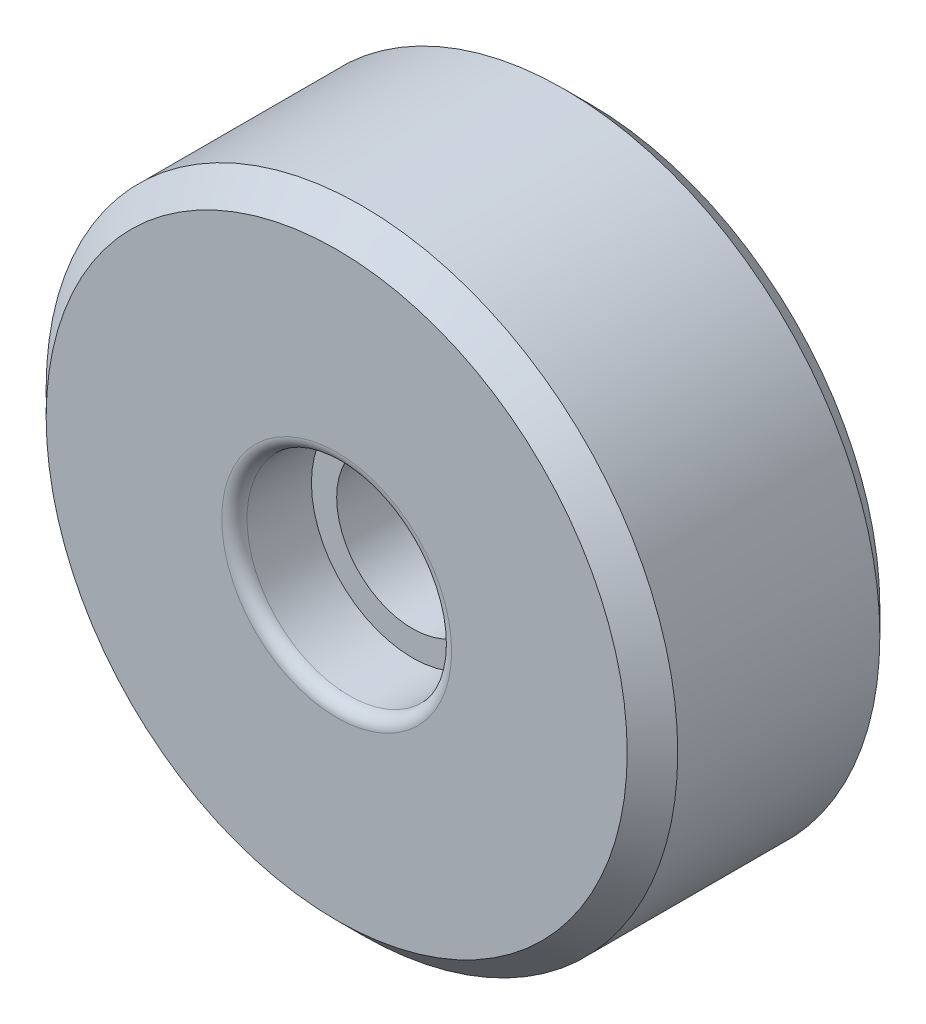
ISO-10303-21;
HEADER;
FILE_DESCRIPTION(('STEP AP214'),'2;1');
FILE_NAME('part.step','',(''),(''),'','','');
FILE_SCHEMA(('AUTOMOTIVE_DESIGN { 1 0 10303 214 1 1 1 1 }'));
ENDSEC;
DATA;
#1=APPLICATION_CONTEXT('core data for automotive mechanical design processes');
#2=APPLICATION_PROTOCOL_DEFINITION('international standard','automotive_design',2000,#1);
#3=PRODUCT_CONTEXT('',#1,'mechanical');
#4=PRODUCT('Part','Part','',(#3));
#5=PRODUCT_RELATED_PRODUCT_CATEGORY('part','',(#4));
#6=PRODUCT_DEFINITION_FORMATION('','',#4);
#7=PRODUCT_DEFINITION_CONTEXT('part definition',#1,'design');
#8=PRODUCT_DEFINITION('design','',#6,#7);
#9=PRODUCT_DEFINITION_SHAPE('','',#8);
#10=(LENGTH_UNIT() NAMED_UNIT(*) SI_UNIT(.MILLI.,.METRE.));
#11=(NAMED_UNIT(*) PLANE_ANGLE_UNIT() SI_UNIT($,.RADIAN.));
#12=(NAMED_UNIT(*) SI_UNIT($,.STERADIAN.) SOLID_ANGLE_UNIT());
#13=UNCERTAINTY_MEASURE_WITH_UNIT(LENGTH_MEASURE(1.E-05),#10,'distance_accuracy_value','');
#14=(GEOMETRIC_REPRESENTATION_CONTEXT(3) GLOBAL_UNCERTAINTY_ASSIGNED_CONTEXT((#13)) GLOBAL_UNIT_ASSIGNED_CONTEXT((#10,
#11,#12)) REPRESENTATION_CONTEXT('',''));
#15=CARTESIAN_POINT('',(0.,0.,0.));
#16=DIRECTION('',(0.,0.,1.));
#17=DIRECTION('',(1.,0.,0.));
#18=AXIS2_PLACEMENT_3D('',#15,#16,#17);
#19=CARTESIAN_POINT('',(0.,0.,7.));
#20=DIRECTION('',(0.,0.,-1.));
#21=DIRECTION('',(-1.,0.,0.));
#22=AXIS2_PLACEMENT_3D('',#19,#20,#21);
#23=CYLINDRICAL_SURFACE('',#22,4.);
#24=CARTESIAN_POINT('',(0.,0.,7.));
#25=DIRECTION('',(0.,0.,-1.));
#26=DIRECTION('',(-1.,0.,0.));
#27=AXIS2_PLACEMENT_3D('',#24,#25,#26);
#28=CIRCLE('',#27,4.);
#29=CARTESIAN_POINT('',(-4.,0.,7.));
#30=VERTEX_POINT('',#29);
#31=EDGE_CURVE('E11',#30,#30,#28,.T.);
#32=ORIENTED_EDGE('',*,*,#31,.T.);
#33=EDGE_LOOP('',(#32));
#34=FACE_BOUND('',#33,.T.);
#35=CARTESIAN_POINT('',(0.,0.,0.));
#36=DIRECTION('',(0.,0.,-1.));
#37=DIRECTION('',(-1.,0.,0.));
#38=AXIS2_PLACEMENT_3D('',#35,#36,#37);
#39=CIRCLE('',#38,4.);
#40=CARTESIAN_POINT('',(-4.,0.,0.));
#41=VERTEX_POINT('',#40);
#42=EDGE_CURVE('E46',#41,#41,#39,.T.);
#43=ORIENTED_EDGE('',*,*,#42,.F.);
#44=EDGE_LOOP('',(#43));
#45=FACE_BOUND('',#44,.T.);
#46=ADVANCED_FACE('F43',(#34,#45),#23,.T.);
#47=CARTESIAN_POINT('',(0.,0.,7.));
#48=DIRECTION('',(0.,0.,-1.));
#49=DIRECTION('',(-1.,0.,0.));
#50=AXIS2_PLACEMENT_3D('',#47,#48,#49);
#51=PLANE('',#50);
#52=CARTESIAN_POINT('',(0.,0.,7.));
#53=DIRECTION('',(0.,0.,-1.));
#54=DIRECTION('',(-1.,0.,0.));
#55=AXIS2_PLACEMENT_3D('',#52,#53,#54);
#56=CIRCLE('',#55,3.);
#57=CARTESIAN_POINT('',(-3.,0.,7.));
#58=VERTEX_POINT('',#57);
#59=EDGE_CURVE('E53',#58,#58,#56,.T.);
#60=ORIENTED_EDGE('',*,*,#59,.T.);
#61=EDGE_LOOP('',(#60));
#62=FACE_BOUND('',#61,.T.);
#63=ORIENTED_EDGE('',*,*,#31,.F.);
#64=EDGE_LOOP('',(#63));
#65=FACE_BOUND('',#64,.T.);
#66=ADVANCED_FACE('F61',(#62,#65),#51,.F.);
#67=CARTESIAN_POINT('',(0.,0.,0.));
#68=DIRECTION('',(0.,0.,-1.));
#69=DIRECTION('',(-1.,0.,0.));
#70=AXIS2_PLACEMENT_3D('',#67,#68,#69);
#71=PLANE('',#70);
#72=CARTESIAN_POINT('',(0.,0.,0.));
#73=DIRECTION('',(0.,0.,-1.));
#74=DIRECTION('',(-1.,0.,0.));
#75=AXIS2_PLACEMENT_3D('',#72,#73,#74);
#76=CIRCLE('',#75,3.);
#77=CARTESIAN_POINT('',(-3.,0.,0.));
#78=VERTEX_POINT('',#77);
#79=EDGE_CURVE('E55',#78,#78,#76,.T.);
#80=ORIENTED_EDGE('',*,*,#79,.F.);
#81=EDGE_LOOP('',(#80));
#82=FACE_BOUND('',#81,.T.);
#83=ORIENTED_EDGE('',*,*,#42,.T.);
#84=EDGE_LOOP('',(#83));
#85=FACE_BOUND('',#84,.T.);
#86=ADVANCED_FACE('F67',(#82,#85),#71,.T.);
#87=CARTESIAN_POINT('',(0.,0.,7.));
#88=DIRECTION('',(0.,0.,-1.));
#89=DIRECTION('',(-1.,0.,0.));
#90=AXIS2_PLACEMENT_3D('',#87,#88,#89);
#91=CYLINDRICAL_SURFACE('',#90,3.);
#92=ORIENTED_EDGE('',*,*,#59,.F.);
#93=EDGE_LOOP('',(#92));
#94=FACE_BOUND('',#93,.T.);
#95=ORIENTED_EDGE('',*,*,#79,.T.);
#96=EDGE_LOOP('',(#95));
#97=FACE_BOUND('',#96,.T.);
#98=ADVANCED_FACE('F64',(#94,#97),#91,.F.);
#99=CLOSED_SHELL('',(#46,#66,#86,#98));
#100=MANIFOLD_SOLID_BREP('B2',#99);
#101=CARTESIAN_POINT('',(0.,0.,10.));
#102=DIRECTION('',(0.,0.,1.));
#103=DIRECTION('',(1.,0.,0.));
#104=AXIS2_PLACEMENT_3D('',#101,#102,#103);
#105=PLANE('',#104);
#106=CARTESIAN_POINT('',(0.,0.,10.));
#107=DIRECTION('',(0.,0.,1.));
#108=DIRECTION('',(1.,0.,0.));
#109=AXIS2_PLACEMENT_3D('',#106,#107,#108);
#110=CIRCLE('',#109,4.55);
#111=CARTESIAN_POINT('',(4.55,0.,10.));
#112=VERTEX_POINT('',#111);
#113=EDGE_CURVE('E42',#112,#112,#110,.F.);
#114=ORIENTED_EDGE('',*,*,#113,.T.);
#115=EDGE_LOOP('',(#114));
#116=FACE_BOUND('',#115,.T.);
#117=CARTESIAN_POINT('',(0.,0.,10.));
#118=DIRECTION('',(0.,0.,1.));
#119=DIRECTION('',(1.,0.,0.));
#120=AXIS2_PLACEMENT_3D('',#117,#118,#119);
#121=CIRCLE('',#120,11.5);
#122=CARTESIAN_POINT('',(11.5,0.,10.));
#123=VERTEX_POINT('',#122);
#124=EDGE_CURVE('E116',#123,#123,#121,.T.);
#125=ORIENTED_EDGE('',*,*,#124,.T.);
#126=EDGE_LOOP('',(#125));
#127=FACE_BOUND('',#126,.T.);
#128=ADVANCED_FACE('F105',(#116,#127),#105,.T.);
#129=CARTESIAN_POINT('',(0.,0.,0.));
#130=DIRECTION('',(0.,0.,1.));
#131=DIRECTION('',(1.,0.,0.));
#132=AXIS2_PLACEMENT_3D('',#129,#130,#131);
#133=PLANE('',#132);
#134=CARTESIAN_POINT('',(0.,0.,0.));
#135=DIRECTION('',(0.,0.,1.));
#136=DIRECTION('',(1.,0.,0.));
#137=AXIS2_PLACEMENT_3D('',#134,#135,#136);
#138=CIRCLE('',#137,11.5);
#139=CARTESIAN_POINT('',(11.5,0.,0.));
#140=VERTEX_POINT('',#139);
#141=EDGE_CURVE('E120',#140,#140,#138,.F.);
#142=ORIENTED_EDGE('',*,*,#141,.T.);
#143=EDGE_LOOP('',(#142));
#144=FACE_BOUND('',#143,.T.);
#145=CARTESIAN_POINT('',(0.,0.,0.));
#146=DIRECTION('',(0.,0.,1.));
#147=DIRECTION('',(1.,0.,0.));
#148=AXIS2_PLACEMENT_3D('',#145,#146,#147);
#149=CIRCLE('',#148,4.05);
#150=CARTESIAN_POINT('',(4.05,0.,0.));
#151=VERTEX_POINT('',#150);
#152=EDGE_CURVE('E131',#151,#151,#149,.T.);
#153=ORIENTED_EDGE('',*,*,#152,.T.);
#154=EDGE_LOOP('',(#153));
#155=FACE_BOUND('',#154,.T.);
#156=ADVANCED_FACE('F135',(#144,#155),#133,.F.);
#157=CARTESIAN_POINT('',(0.,0.,10.));
#158=DIRECTION('',(0.,0.,-1.));
#159=DIRECTION('',(-1.,0.,0.));
#160=AXIS2_PLACEMENT_3D('',#157,#158,#159);
#161=CYLINDRICAL_SURFACE('',#160,12.5);
#162=CARTESIAN_POINT('',(0.,0.,1.));
#163=DIRECTION('',(0.,0.,1.));
#164=DIRECTION('',(1.,0.,0.));
#165=AXIS2_PLACEMENT_3D('',#162,#163,#164);
#166=CIRCLE('',#165,12.5);
#167=CARTESIAN_POINT('',(12.5,0.,1.));
#168=VERTEX_POINT('',#167);
#169=EDGE_CURVE('E125',#168,#168,#166,.T.);
#170=ORIENTED_EDGE('',*,*,#169,.T.);
#171=EDGE_LOOP('',(#170));
#172=FACE_BOUND('',#171,.T.);
#173=CARTESIAN_POINT('',(0.,0.,8.99999999999999));
#174=DIRECTION('',(0.,0.,1.));
#175=DIRECTION('',(1.,0.,0.));
#176=AXIS2_PLACEMENT_3D('',#173,#174,#175);
#177=CIRCLE('',#176,12.5);
#178=CARTESIAN_POINT('',(12.5,0.,8.99999999999999));
#179=VERTEX_POINT('',#178);
#180=EDGE_CURVE('E128',#179,#179,#177,.F.);
#181=ORIENTED_EDGE('',*,*,#180,.T.);
#182=EDGE_LOOP('',(#181));
#183=FACE_BOUND('',#182,.T.);
#184=ADVANCED_FACE('F140',(#172,#183),#161,.T.);
#185=CARTESIAN_POINT('',(0.,0.,10.));
#186=DIRECTION('',(0.,0.,-1.));
#187=DIRECTION('',(-1.,0.,0.));
#188=AXIS2_PLACEMENT_3D('',#185,#186,#187);
#189=CYLINDRICAL_SURFACE('',#188,4.05);
#190=CARTESIAN_POINT('',(0.,0.,9.5));
#191=DIRECTION('',(0.,0.,1.));
#192=DIRECTION('',(1.,0.,0.));
#193=AXIS2_PLACEMENT_3D('',#190,#191,#192);
#194=CIRCLE('',#193,4.05);
#195=CARTESIAN_POINT('',(4.05,0.,9.5));
#196=VERTEX_POINT('',#195);
#197=EDGE_CURVE('E112',#196,#196,#194,.T.);
#198=ORIENTED_EDGE('',*,*,#197,.T.);
#199=EDGE_LOOP('',(#198));
#200=FACE_BOUND('',#199,.T.);
#201=ORIENTED_EDGE('',*,*,#152,.F.);
#202=EDGE_LOOP('',(#201));
#203=FACE_BOUND('',#202,.T.);
#204=ADVANCED_FACE('F137',(#200,#203),#189,.F.);
#205=CARTESIAN_POINT('',(0.,0.,1.));
#206=DIRECTION('',(0.,0.,1.));
#207=DIRECTION('',(1.,0.,0.));
#208=AXIS2_PLACEMENT_3D('',#205,#206,#207);
#209=CONICAL_SURFACE('',#208,12.5,0.78539816339745);
#210=ORIENTED_EDGE('',*,*,#141,.F.);
#211=EDGE_LOOP('',(#210));
#212=FACE_BOUND('',#211,.T.);
#213=ORIENTED_EDGE('',*,*,#169,.F.);
#214=EDGE_LOOP('',(#213));
#215=FACE_BOUND('',#214,.T.);
#216=ADVANCED_FACE('F139',(#212,#215),#209,.T.);
#217=CARTESIAN_POINT('',(0.,0.,10.));
#218=DIRECTION('',(0.,0.,-1.));
#219=DIRECTION('',(-1.,0.,0.));
#220=AXIS2_PLACEMENT_3D('',#217,#218,#219);
#221=CONICAL_SURFACE('',#220,11.5,0.785398163397446);
#222=ORIENTED_EDGE('',*,*,#180,.F.);
#223=EDGE_LOOP('',(#222));
#224=FACE_BOUND('',#223,.T.);
#225=ORIENTED_EDGE('',*,*,#124,.F.);
#226=EDGE_LOOP('',(#225));
#227=FACE_BOUND('',#226,.T.);
#228=ADVANCED_FACE('F146',(#224,#227),#221,.T.);
#229=CARTESIAN_POINT('',(0.,0.,9.5));
#230=DIRECTION('',(0.,0.,1.));
#231=DIRECTION('',(1.,0.,0.));
#232=AXIS2_PLACEMENT_3D('',#229,#230,#231);
#233=TOROIDAL_SURFACE('',#232,4.55,0.5);
#234=ORIENTED_EDGE('',*,*,#113,.F.);
#235=EDGE_LOOP('',(#234));
#236=FACE_BOUND('',#235,.T.);
#237=ORIENTED_EDGE('',*,*,#197,.F.);
#238=EDGE_LOOP('',(#237));
#239=FACE_BOUND('',#238,.T.);
#240=ADVANCED_FACE('F107',(#236,#239),#233,.T.);
#241=CLOSED_SHELL('',(#128,#156,#184,#204,#216,#228,#240));
#242=MANIFOLD_SOLID_BREP('B6',#241);
#243=ADVANCED_BREP_SHAPE_REPRESENTATION('',(#18,#100,#242),#14);
#244=SHAPE_DEFINITION_REPRESENTATION(#9,#243);
ENDSEC;
END-ISO-10303-21;
